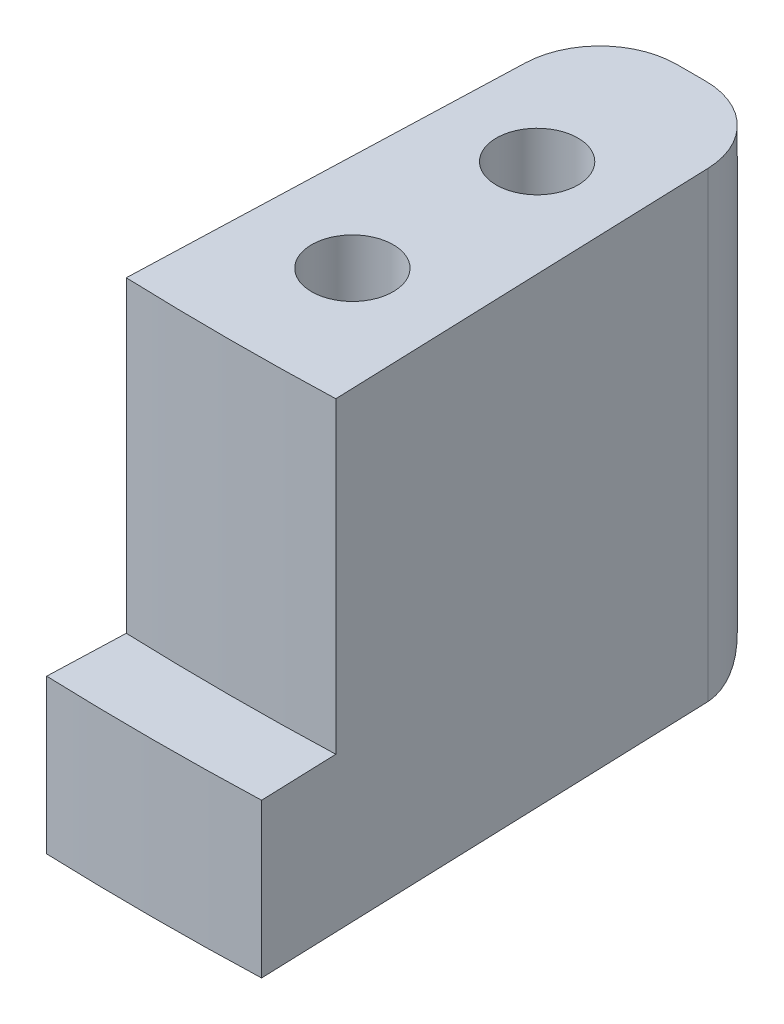
ISO-10303-21;
HEADER;
FILE_DESCRIPTION(('STEP AP214'),'2;1');
FILE_NAME('part.step','',(''),(''),'','','');
FILE_SCHEMA(('AUTOMOTIVE_DESIGN { 1 0 10303 214 1 1 1 1 }'));
ENDSEC;
DATA;
#1=APPLICATION_CONTEXT('core data for automotive mechanical design processes');
#2=APPLICATION_PROTOCOL_DEFINITION('international standard','automotive_design',2000,#1);
#3=PRODUCT_CONTEXT('',#1,'mechanical');
#4=PRODUCT('Part','Part','',(#3));
#5=PRODUCT_RELATED_PRODUCT_CATEGORY('part','',(#4));
#6=PRODUCT_DEFINITION_FORMATION('','',#4);
#7=PRODUCT_DEFINITION_CONTEXT('part definition',#1,'design');
#8=PRODUCT_DEFINITION('design','',#6,#7);
#9=PRODUCT_DEFINITION_SHAPE('','',#8);
#10=(LENGTH_UNIT() NAMED_UNIT(*) SI_UNIT(.MILLI.,.METRE.));
#11=(NAMED_UNIT(*) PLANE_ANGLE_UNIT() SI_UNIT($,.RADIAN.));
#12=(NAMED_UNIT(*) SI_UNIT($,.STERADIAN.) SOLID_ANGLE_UNIT());
#13=UNCERTAINTY_MEASURE_WITH_UNIT(LENGTH_MEASURE(1.E-05),#10,'distance_accuracy_value','');
#14=(GEOMETRIC_REPRESENTATION_CONTEXT(3) GLOBAL_UNCERTAINTY_ASSIGNED_CONTEXT((#13)) GLOBAL_UNIT_ASSIGNED_CONTEXT((#10,
#11,#12)) REPRESENTATION_CONTEXT('',''));
#15=CARTESIAN_POINT('',(0.,0.,0.));
#16=DIRECTION('',(0.,0.,1.));
#17=DIRECTION('',(1.,0.,0.));
#18=AXIS2_PLACEMENT_3D('',#15,#16,#17);
#19=CARTESIAN_POINT('',(0.,30.,175.));
#20=DIRECTION('',(0.,1.,0.));
#21=DIRECTION('',(0.,0.,1.));
#22=AXIS2_PLACEMENT_3D('',#19,#20,#21);
#23=CYLINDRICAL_SURFACE('',#22,2.65);
#24=CARTESIAN_POINT('',(0.,30.,175.));
#25=DIRECTION('',(0.,1.,0.));
#26=DIRECTION('',(0.,0.,1.));
#27=AXIS2_PLACEMENT_3D('',#24,#25,#26);
#28=CIRCLE('',#27,2.65);
#29=CARTESIAN_POINT('',(0.,30.,177.65));
#30=VERTEX_POINT('',#29);
#31=EDGE_CURVE('E285',#30,#30,#28,.T.);
#32=ORIENTED_EDGE('',*,*,#31,.T.);
#33=EDGE_LOOP('',(#32));
#34=FACE_BOUND('',#33,.T.);
#35=CARTESIAN_POINT('',(0.,5.,175.));
#36=DIRECTION('',(0.,-1.,0.));
#37=DIRECTION('',(0.,0.,-1.));
#38=AXIS2_PLACEMENT_3D('',#35,#36,#37);
#39=CIRCLE('',#38,2.65);
#40=CARTESIAN_POINT('',(0.,5.,172.35));
#41=VERTEX_POINT('',#40);
#42=EDGE_CURVE('E40',#41,#41,#39,.F.);
#43=ORIENTED_EDGE('',*,*,#42,.F.);
#44=EDGE_LOOP('',(#43));
#45=FACE_BOUND('',#44,.T.);
#46=ADVANCED_FACE('F36',(#34,#45),#23,.F.);
#47=CARTESIAN_POINT('',(0.,30.,187.));
#48=DIRECTION('',(0.,1.,0.));
#49=DIRECTION('',(0.,0.,1.));
#50=AXIS2_PLACEMENT_3D('',#47,#48,#49);
#51=CYLINDRICAL_SURFACE('',#50,2.65);
#52=CARTESIAN_POINT('',(0.,30.,187.));
#53=DIRECTION('',(0.,1.,0.));
#54=DIRECTION('',(0.,0.,1.));
#55=AXIS2_PLACEMENT_3D('',#52,#53,#54);
#56=CIRCLE('',#55,2.65);
#57=CARTESIAN_POINT('',(0.,30.,189.65));
#58=VERTEX_POINT('',#57);
#59=EDGE_CURVE('E282',#58,#58,#56,.T.);
#60=ORIENTED_EDGE('',*,*,#59,.T.);
#61=EDGE_LOOP('',(#60));
#62=FACE_BOUND('',#61,.T.);
#63=CARTESIAN_POINT('',(0.,5.,187.));
#64=DIRECTION('',(0.,-1.,0.));
#65=DIRECTION('',(0.,0.,-1.));
#66=AXIS2_PLACEMENT_3D('',#63,#64,#65);
#67=CIRCLE('',#66,2.65);
#68=CARTESIAN_POINT('',(0.,5.,184.35));
#69=VERTEX_POINT('',#68);
#70=EDGE_CURVE('E229',#69,#69,#67,.F.);
#71=ORIENTED_EDGE('',*,*,#70,.F.);
#72=EDGE_LOOP('',(#71));
#73=FACE_BOUND('',#72,.T.);
#74=ADVANCED_FACE('F355',(#62,#73),#51,.F.);
#75=CARTESIAN_POINT('',(0.,30.,0.));
#76=DIRECTION('',(0.999390827019096,0.,0.034899496702501));
#77=DIRECTION('',(0.034899496702501,0.,-0.999390827019096));
#78=AXIS2_PLACEMENT_3D('',#75,#76,#77);
#79=PLANE('',#78);
#80=DIRECTION('',(-0.034899496702501,0.,0.999390827019096));
#81=VECTOR('',#80,1.);
#82=CARTESIAN_POINT('',(0.,30.,0.));
#83=LINE('',#82,#81);
#84=CARTESIAN_POINT('',(-5.93043722719849,30.,169.825502516488));
#85=VERTEX_POINT('',#84);
#86=CARTESIAN_POINT('',(-6.80540185698768,30.,194.881211268724));
#87=VERTEX_POINT('',#86);
#88=EDGE_CURVE('E310',#85,#87,#83,.T.);
#89=ORIENTED_EDGE('',*,*,#88,.F.);
#90=DIRECTION('',(0.,-1.,0.));
#91=VECTOR('',#90,1.);
#92=CARTESIAN_POINT('',(-5.93043722719848,0.,169.825502516488));
#93=LINE('',#92,#91);
#94=CARTESIAN_POINT('',(-5.93043722719848,0.00304586490452183,169.825502516488));
#95=VERTEX_POINT('',#94);
#96=EDGE_CURVE('E330',#85,#95,#93,.T.);
#97=ORIENTED_EDGE('',*,*,#96,.T.);
#98=CARTESIAN_POINT('',(-5.93653081359711,5.,170.));
#99=DIRECTION('',(0.999390827019096,0.,0.034899496702501));
#100=DIRECTION('',(-0.034899496702501,0.,0.999390827019096));
#101=AXIS2_PLACEMENT_3D('',#98,#99,#100);
#102=ELLIPSE('',#101,5.00304772149411,5.);
#103=CARTESIAN_POINT('',(-5.93653081359711,0.,170.));
#104=VERTEX_POINT('',#103);
#105=EDGE_CURVE('E328',#95,#104,#102,.F.);
#106=ORIENTED_EDGE('',*,*,#105,.T.);
#107=DIRECTION('',(-0.034899496702501,0.,0.999390827019096));
#108=VECTOR('',#107,1.);
#109=CARTESIAN_POINT('',(0.,0.,0.));
#110=LINE('',#109,#108);
#111=CARTESIAN_POINT('',(-6.97989934050019,0.,199.878165403819));
#112=VERTEX_POINT('',#111);
#113=EDGE_CURVE('E309',#104,#112,#110,.T.);
#114=ORIENTED_EDGE('',*,*,#113,.T.);
#115=DIRECTION('',(0.,-1.,0.));
#116=VECTOR('',#115,1.);
#117=CARTESIAN_POINT('',(-6.97989934050019,10.,199.878165403819));
#118=LINE('',#117,#116);
#119=CARTESIAN_POINT('',(-6.97989934050019,10.,199.878165403819));
#120=VERTEX_POINT('',#119);
#121=EDGE_CURVE('E306',#120,#112,#118,.T.);
#122=ORIENTED_EDGE('',*,*,#121,.F.);
#123=DIRECTION('',(-0.034899496702501,0.,0.999390827019096));
#124=VECTOR('',#123,1.);
#125=CARTESIAN_POINT('',(0.,10.,0.));
#126=LINE('',#125,#124);
#127=CARTESIAN_POINT('',(-6.80540185698768,10.,194.881211268724));
#128=VERTEX_POINT('',#127);
#129=EDGE_CURVE('E289',#128,#120,#126,.T.);
#130=ORIENTED_EDGE('',*,*,#129,.F.);
#131=DIRECTION('',(0.,-1.,0.));
#132=VECTOR('',#131,1.);
#133=CARTESIAN_POINT('',(-6.80540185698768,30.,194.881211268724));
#134=LINE('',#133,#132);
#135=EDGE_CURVE('E326',#87,#128,#134,.T.);
#136=ORIENTED_EDGE('',*,*,#135,.F.);
#137=EDGE_LOOP('',(#89,#97,#106,#114,#122,#130,#136));
#138=FACE_BOUND('',#137,.T.);
#139=ADVANCED_FACE('F362',(#138),#79,.F.);
#140=CARTESIAN_POINT('',(0.,30.,0.));
#141=DIRECTION('',(0.,-1.,0.));
#142=DIRECTION('',(0.,0.,-1.));
#143=AXIS2_PLACEMENT_3D('',#140,#141,#142);
#144=CYLINDRICAL_SURFACE('',#143,195.);
#145=ORIENTED_EDGE('',*,*,#135,.T.);
#146=CARTESIAN_POINT('',(0.,10.,0.));
#147=DIRECTION('',(0.,1.,0.));
#148=DIRECTION('',(0.,0.,1.));
#149=AXIS2_PLACEMENT_3D('',#146,#147,#148);
#150=CIRCLE('',#149,195.);
#151=CARTESIAN_POINT('',(6.80540185698774,10.,194.881211268724));
#152=VERTEX_POINT('',#151);
#153=EDGE_CURVE('E298',#128,#152,#150,.T.);
#154=ORIENTED_EDGE('',*,*,#153,.T.);
#155=DIRECTION('',(0.,-1.,0.));
#156=VECTOR('',#155,1.);
#157=CARTESIAN_POINT('',(6.80540185698774,30.,194.881211268724));
#158=LINE('',#157,#156);
#159=CARTESIAN_POINT('',(6.80540185698774,30.,194.881211268724));
#160=VERTEX_POINT('',#159);
#161=EDGE_CURVE('E321',#160,#152,#158,.T.);
#162=ORIENTED_EDGE('',*,*,#161,.F.);
#163=CARTESIAN_POINT('',(0.,30.,0.));
#164=DIRECTION('',(0.,1.,0.));
#165=DIRECTION('',(0.,0.,1.));
#166=AXIS2_PLACEMENT_3D('',#163,#164,#165);
#167=CIRCLE('',#166,195.);
#168=EDGE_CURVE('E312',#87,#160,#167,.T.);
#169=ORIENTED_EDGE('',*,*,#168,.F.);
#170=EDGE_LOOP('',(#145,#154,#162,#169));
#171=FACE_BOUND('',#170,.T.);
#172=ADVANCED_FACE('F390',(#171),#144,.T.);
#173=CARTESIAN_POINT('',(0.,30.,0.));
#174=DIRECTION('',(0.999390827019096,0.,-0.0348994967025013));
#175=DIRECTION('',(-0.0348994967025013,0.,-0.999390827019096));
#176=AXIS2_PLACEMENT_3D('',#173,#174,#175);
#177=PLANE('',#176);
#178=CARTESIAN_POINT('',(5.93653081359717,5.,170.));
#179=DIRECTION('',(0.999390827019096,0.,-0.0348994967025013));
#180=DIRECTION('',(-0.0348994967025013,0.,-0.999390827019096));
#181=AXIS2_PLACEMENT_3D('',#178,#179,#180);
#182=ELLIPSE('',#181,5.00304772149411,5.);
#183=CARTESIAN_POINT('',(5.93653081359717,0.,170.));
#184=VERTEX_POINT('',#183);
#185=CARTESIAN_POINT('',(5.93043722719854,0.00304586490452313,169.825502516488));
#186=VERTEX_POINT('',#185);
#187=EDGE_CURVE('E343',#184,#186,#182,.T.);
#188=ORIENTED_EDGE('',*,*,#187,.T.);
#189=DIRECTION('',(0.,-1.,0.));
#190=VECTOR('',#189,1.);
#191=CARTESIAN_POINT('',(5.93043722719854,30.,169.825502516488));
#192=LINE('',#191,#190);
#193=CARTESIAN_POINT('',(5.93043722719854,30.,169.825502516488));
#194=VERTEX_POINT('',#193);
#195=EDGE_CURVE('E45',#186,#194,#192,.F.);
#196=ORIENTED_EDGE('',*,*,#195,.T.);
#197=DIRECTION('',(0.0348994967025013,0.,0.999390827019096));
#198=VECTOR('',#197,1.);
#199=CARTESIAN_POINT('',(0.,30.,0.));
#200=LINE('',#199,#198);
#201=EDGE_CURVE('E316',#194,#160,#200,.T.);
#202=ORIENTED_EDGE('',*,*,#201,.T.);
#203=ORIENTED_EDGE('',*,*,#161,.T.);
#204=DIRECTION('',(0.0348994967025013,0.,0.999390827019096));
#205=VECTOR('',#204,1.);
#206=CARTESIAN_POINT('',(0.,10.,0.));
#207=LINE('',#206,#205);
#208=CARTESIAN_POINT('',(6.97989934050026,10.,199.878165403819));
#209=VERTEX_POINT('',#208);
#210=EDGE_CURVE('E295',#152,#209,#207,.T.);
#211=ORIENTED_EDGE('',*,*,#210,.T.);
#212=DIRECTION('',(0.,-1.,0.));
#213=VECTOR('',#212,1.);
#214=CARTESIAN_POINT('',(6.97989934050026,10.,199.878165403819));
#215=LINE('',#214,#213);
#216=CARTESIAN_POINT('',(6.97989934050026,0.,199.878165403819));
#217=VERTEX_POINT('',#216);
#218=EDGE_CURVE('E300',#209,#217,#215,.T.);
#219=ORIENTED_EDGE('',*,*,#218,.T.);
#220=DIRECTION('',(0.0348994967025013,0.,0.999390827019096));
#221=VECTOR('',#220,1.);
#222=CARTESIAN_POINT('',(0.,0.,0.));
#223=LINE('',#222,#221);
#224=EDGE_CURVE('E313',#184,#217,#223,.T.);
#225=ORIENTED_EDGE('',*,*,#224,.F.);
#226=EDGE_LOOP('',(#188,#196,#202,#203,#211,#219,#225));
#227=FACE_BOUND('',#226,.T.);
#228=ADVANCED_FACE('F386',(#227),#177,.T.);
#229=CARTESIAN_POINT('',(0.,30.,165.));
#230=DIRECTION('',(0.,0.,-1.));
#231=DIRECTION('',(-1.,0.,0.));
#232=AXIS2_PLACEMENT_3D('',#229,#230,#231);
#233=PLANE('',#232);
#234=DIRECTION('',(1.,0.,0.));
#235=VECTOR('',#234,1.);
#236=CARTESIAN_POINT('',(-5.76192696613837,5.,165.));
#237=LINE('',#236,#235);
#238=CARTESIAN_POINT('',(0.933483092103059,5.,165.));
#239=VERTEX_POINT('',#238);
#240=CARTESIAN_POINT('',(-0.933483092103004,5.,165.));
#241=VERTEX_POINT('',#240);
#242=EDGE_CURVE('E333',#239,#241,#237,.F.);
#243=ORIENTED_EDGE('',*,*,#242,.T.);
#244=DIRECTION('',(0.,-1.,0.));
#245=VECTOR('',#244,1.);
#246=CARTESIAN_POINT('',(-0.933483092103004,30.,165.));
#247=LINE('',#246,#245);
#248=CARTESIAN_POINT('',(-0.933483092103004,30.,165.));
#249=VERTEX_POINT('',#248);
#250=EDGE_CURVE('E337',#241,#249,#247,.F.);
#251=ORIENTED_EDGE('',*,*,#250,.T.);
#252=DIRECTION('',(1.,0.,0.));
#253=VECTOR('',#252,1.);
#254=CARTESIAN_POINT('',(0.,30.,165.));
#255=LINE('',#254,#253);
#256=CARTESIAN_POINT('',(0.933483092103059,30.,165.));
#257=VERTEX_POINT('',#256);
#258=EDGE_CURVE('E318',#249,#257,#255,.T.);
#259=ORIENTED_EDGE('',*,*,#258,.T.);
#260=DIRECTION('',(0.,-1.,0.));
#261=VECTOR('',#260,1.);
#262=CARTESIAN_POINT('',(0.933483092103059,30.,165.));
#263=LINE('',#262,#261);
#264=EDGE_CURVE('E335',#257,#239,#263,.T.);
#265=ORIENTED_EDGE('',*,*,#264,.T.);
#266=EDGE_LOOP('',(#243,#251,#259,#265));
#267=FACE_BOUND('',#266,.T.);
#268=ADVANCED_FACE('F379',(#267),#233,.T.);
#269=CARTESIAN_POINT('',(0.,30.,0.));
#270=DIRECTION('',(0.,1.,0.));
#271=DIRECTION('',(0.,0.,1.));
#272=AXIS2_PLACEMENT_3D('',#269,#270,#271);
#273=PLANE('',#272);
#274=ORIENTED_EDGE('',*,*,#59,.F.);
#275=EDGE_LOOP('',(#274));
#276=FACE_BOUND('',#275,.T.);
#277=ORIENTED_EDGE('',*,*,#31,.F.);
#278=EDGE_LOOP('',(#277));
#279=FACE_BOUND('',#278,.T.);
#280=ORIENTED_EDGE('',*,*,#258,.F.);
#281=CARTESIAN_POINT('',(-0.933483092103004,30.,170.));
#282=DIRECTION('',(0.,1.,0.));
#283=DIRECTION('',(0.,0.,1.));
#284=AXIS2_PLACEMENT_3D('',#281,#282,#283);
#285=CIRCLE('',#284,5.);
#286=EDGE_CURVE('E341',#249,#85,#285,.T.);
#287=ORIENTED_EDGE('',*,*,#286,.T.);
#288=ORIENTED_EDGE('',*,*,#88,.T.);
#289=ORIENTED_EDGE('',*,*,#168,.T.);
#290=ORIENTED_EDGE('',*,*,#201,.F.);
#291=CARTESIAN_POINT('',(0.933483092103059,30.,170.));
#292=DIRECTION('',(0.,1.,0.));
#293=DIRECTION('',(0.,0.,1.));
#294=AXIS2_PLACEMENT_3D('',#291,#292,#293);
#295=CIRCLE('',#294,5.);
#296=EDGE_CURVE('E339',#194,#257,#295,.T.);
#297=ORIENTED_EDGE('',*,*,#296,.T.);
#298=EDGE_LOOP('',(#280,#287,#288,#289,#290,#297));
#299=FACE_BOUND('',#298,.T.);
#300=ADVANCED_FACE('F376',(#276,#279,#299),#273,.T.);
#301=CARTESIAN_POINT('',(0.,0.,0.));
#302=DIRECTION('',(0.,1.,0.));
#303=DIRECTION('',(0.,0.,1.));
#304=AXIS2_PLACEMENT_3D('',#301,#302,#303);
#305=PLANE('',#304);
#306=DIRECTION('',(0.5,0.,-0.866025403784439));
#307=VECTOR('',#306,1.);
#308=CARTESIAN_POINT('',(-4.7920072342739,0.,175.));
#309=LINE('',#308,#307);
#310=CARTESIAN_POINT('',(-4.79200723427387,0.,175.));
#311=VERTEX_POINT('',#310);
#312=CARTESIAN_POINT('',(-2.39600361713693,0.,170.85));
#313=VERTEX_POINT('',#312);
#314=EDGE_CURVE('E216',#311,#313,#309,.T.);
#315=ORIENTED_EDGE('',*,*,#314,.F.);
#316=DIRECTION('',(-0.5,0.,-0.866025403784439));
#317=VECTOR('',#316,1.);
#318=CARTESIAN_POINT('',(-2.39600361713698,0.,179.15));
#319=LINE('',#318,#317);
#320=CARTESIAN_POINT('',(-2.39600361713698,0.,179.15));
#321=VERTEX_POINT('',#320);
#322=EDGE_CURVE('E53',#321,#311,#319,.T.);
#323=ORIENTED_EDGE('',*,*,#322,.F.);
#324=DIRECTION('',(-1.,0.,0.));
#325=VECTOR('',#324,1.);
#326=CARTESIAN_POINT('',(2.39600361713694,0.,179.15));
#327=LINE('',#326,#325);
#328=CARTESIAN_POINT('',(2.39600361713694,0.,179.15));
#329=VERTEX_POINT('',#328);
#330=EDGE_CURVE('E202',#329,#321,#327,.T.);
#331=ORIENTED_EDGE('',*,*,#330,.F.);
#332=DIRECTION('',(-0.5,0.,0.866025403784438));
#333=VECTOR('',#332,1.);
#334=CARTESIAN_POINT('',(4.79200723427388,0.,175.));
#335=LINE('',#334,#333);
#336=CARTESIAN_POINT('',(4.79200723427388,0.,175.));
#337=VERTEX_POINT('',#336);
#338=EDGE_CURVE('E205',#337,#329,#335,.T.);
#339=ORIENTED_EDGE('',*,*,#338,.F.);
#340=DIRECTION('',(0.5,0.,0.866025403784439));
#341=VECTOR('',#340,1.);
#342=CARTESIAN_POINT('',(2.39600361713692,0.,170.85));
#343=LINE('',#342,#341);
#344=CARTESIAN_POINT('',(2.39600361713692,0.,170.85));
#345=VERTEX_POINT('',#344);
#346=EDGE_CURVE('E222',#345,#337,#343,.T.);
#347=ORIENTED_EDGE('',*,*,#346,.F.);
#348=DIRECTION('',(1.,0.,0.));
#349=VECTOR('',#348,1.);
#350=CARTESIAN_POINT('',(-2.39600361713693,0.,170.85));
#351=LINE('',#350,#349);
#352=EDGE_CURVE('E219',#313,#345,#351,.T.);
#353=ORIENTED_EDGE('',*,*,#352,.F.);
#354=EDGE_LOOP('',(#315,#323,#331,#339,#347,#353));
#355=FACE_BOUND('',#354,.T.);
#356=DIRECTION('',(0.500000000000001,0.,-0.866025403784438));
#357=VECTOR('',#356,1.);
#358=CARTESIAN_POINT('',(-4.79200723427391,0.,187.));
#359=LINE('',#358,#357);
#360=CARTESIAN_POINT('',(-4.79200723427391,0.,187.));
#361=VERTEX_POINT('',#360);
#362=CARTESIAN_POINT('',(-2.39600361713695,0.,182.85));
#363=VERTEX_POINT('',#362);
#364=EDGE_CURVE('E258',#361,#363,#359,.T.);
#365=ORIENTED_EDGE('',*,*,#364,.F.);
#366=DIRECTION('',(-0.499999999999999,0.,-0.866025403784439));
#367=VECTOR('',#366,1.);
#368=CARTESIAN_POINT('',(-2.39600361713696,0.,191.15));
#369=LINE('',#368,#367);
#370=CARTESIAN_POINT('',(-2.39600361713696,0.,191.15));
#371=VERTEX_POINT('',#370);
#372=EDGE_CURVE('E61',#371,#361,#369,.T.);
#373=ORIENTED_EDGE('',*,*,#372,.F.);
#374=DIRECTION('',(-1.,0.,0.));
#375=VECTOR('',#374,1.);
#376=CARTESIAN_POINT('',(2.39600361713698,0.,191.15));
#377=LINE('',#376,#375);
#378=CARTESIAN_POINT('',(2.39600361713698,0.,191.15));
#379=VERTEX_POINT('',#378);
#380=EDGE_CURVE('E241',#379,#371,#377,.T.);
#381=ORIENTED_EDGE('',*,*,#380,.F.);
#382=DIRECTION('',(-0.5,0.,0.866025403784439));
#383=VECTOR('',#382,1.);
#384=CARTESIAN_POINT('',(4.79200723427392,0.,187.));
#385=LINE('',#384,#383);
#386=CARTESIAN_POINT('',(4.79200723427392,0.,187.));
#387=VERTEX_POINT('',#386);
#388=EDGE_CURVE('E267',#387,#379,#385,.T.);
#389=ORIENTED_EDGE('',*,*,#388,.F.);
#390=DIRECTION('',(0.5,0.,0.866025403784439));
#391=VECTOR('',#390,1.);
#392=CARTESIAN_POINT('',(2.39600361713694,0.,182.85));
#393=LINE('',#392,#391);
#394=CARTESIAN_POINT('',(2.39600361713694,0.,182.85));
#395=VERTEX_POINT('',#394);
#396=EDGE_CURVE('E264',#395,#387,#393,.T.);
#397=ORIENTED_EDGE('',*,*,#396,.F.);
#398=DIRECTION('',(1.,0.,0.));
#399=VECTOR('',#398,1.);
#400=CARTESIAN_POINT('',(-2.39600361713695,0.,182.85));
#401=LINE('',#400,#399);
#402=EDGE_CURVE('E261',#363,#395,#401,.T.);
#403=ORIENTED_EDGE('',*,*,#402,.F.);
#404=EDGE_LOOP('',(#365,#373,#381,#389,#397,#403));
#405=FACE_BOUND('',#404,.T.);
#406=ORIENTED_EDGE('',*,*,#113,.F.);
#407=DIRECTION('',(1.,0.,0.));
#408=VECTOR('',#407,1.);
#409=CARTESIAN_POINT('',(5.76192696613841,0.,170.));
#410=LINE('',#409,#408);
#411=EDGE_CURVE('E11',#104,#184,#410,.T.);
#412=ORIENTED_EDGE('',*,*,#411,.T.);
#413=ORIENTED_EDGE('',*,*,#224,.T.);
#414=CARTESIAN_POINT('',(0.,0.,0.));
#415=DIRECTION('',(0.,1.,0.));
#416=DIRECTION('',(0.,0.,1.));
#417=AXIS2_PLACEMENT_3D('',#414,#415,#416);
#418=CIRCLE('',#417,200.);
#419=EDGE_CURVE('E293',#112,#217,#418,.T.);
#420=ORIENTED_EDGE('',*,*,#419,.F.);
#421=EDGE_LOOP('',(#406,#412,#413,#420));
#422=FACE_BOUND('',#421,.T.);
#423=ADVANCED_FACE('F374',(#355,#405,#422),#305,.F.);
#424=CARTESIAN_POINT('',(0.,10.,0.));
#425=DIRECTION('',(0.,-1.,0.));
#426=DIRECTION('',(0.,0.,-1.));
#427=AXIS2_PLACEMENT_3D('',#424,#425,#426);
#428=CYLINDRICAL_SURFACE('',#427,200.);
#429=ORIENTED_EDGE('',*,*,#419,.T.);
#430=ORIENTED_EDGE('',*,*,#218,.F.);
#431=CARTESIAN_POINT('',(0.,10.,0.));
#432=DIRECTION('',(0.,1.,0.));
#433=DIRECTION('',(0.,0.,1.));
#434=AXIS2_PLACEMENT_3D('',#431,#432,#433);
#435=CIRCLE('',#434,200.);
#436=EDGE_CURVE('E292',#120,#209,#435,.T.);
#437=ORIENTED_EDGE('',*,*,#436,.F.);
#438=ORIENTED_EDGE('',*,*,#121,.T.);
#439=EDGE_LOOP('',(#429,#430,#437,#438));
#440=FACE_BOUND('',#439,.T.);
#441=ADVANCED_FACE('F370',(#440),#428,.T.);
#442=CARTESIAN_POINT('',(0.,10.,0.));
#443=DIRECTION('',(0.,1.,0.));
#444=DIRECTION('',(0.,0.,1.));
#445=AXIS2_PLACEMENT_3D('',#442,#443,#444);
#446=PLANE('',#445);
#447=ORIENTED_EDGE('',*,*,#129,.T.);
#448=ORIENTED_EDGE('',*,*,#436,.T.);
#449=ORIENTED_EDGE('',*,*,#210,.F.);
#450=ORIENTED_EDGE('',*,*,#153,.F.);
#451=EDGE_LOOP('',(#447,#448,#449,#450));
#452=FACE_BOUND('',#451,.T.);
#453=ADVANCED_FACE('F367',(#452),#446,.T.);
#454=CARTESIAN_POINT('',(0.933483092103059,30.,170.));
#455=DIRECTION('',(0.,-1.,0.));
#456=DIRECTION('',(0.,0.,-1.));
#457=AXIS2_PLACEMENT_3D('',#454,#455,#456);
#458=CYLINDRICAL_SURFACE('',#457,5.);
#459=ORIENTED_EDGE('',*,*,#296,.F.);
#460=ORIENTED_EDGE('',*,*,#195,.F.);
#461=CARTESIAN_POINT('',(0.933483092103059,5.,170.));
#462=DIRECTION('',(-0.707106781186547,-0.707106781186547,0.));
#463=DIRECTION('',(-0.707106781186547,0.707106781186547,0.));
#464=AXIS2_PLACEMENT_3D('',#461,#462,#463);
#465=ELLIPSE('',#464,7.07106781186547,5.);
#466=EDGE_CURVE('E303',#239,#186,#465,.T.);
#467=ORIENTED_EDGE('',*,*,#466,.F.);
#468=ORIENTED_EDGE('',*,*,#264,.F.);
#469=EDGE_LOOP('',(#459,#460,#467,#468));
#470=FACE_BOUND('',#469,.T.);
#471=ADVANCED_FACE('F38',(#470),#458,.T.);
#472=CARTESIAN_POINT('',(0.,5.,170.));
#473=DIRECTION('',(-1.,0.,0.));
#474=DIRECTION('',(0.,0.,1.));
#475=AXIS2_PLACEMENT_3D('',#472,#473,#474);
#476=CYLINDRICAL_SURFACE('',#475,5.);
#477=ORIENTED_EDGE('',*,*,#411,.F.);
#478=ORIENTED_EDGE('',*,*,#105,.F.);
#479=CARTESIAN_POINT('',(-0.933483092103004,5.,170.));
#480=DIRECTION('',(-0.707106781186547,0.707106781186547,0.));
#481=DIRECTION('',(-0.707106781186547,-0.707106781186547,0.));
#482=AXIS2_PLACEMENT_3D('',#479,#480,#481);
#483=ELLIPSE('',#482,7.07106781186547,5.);
#484=EDGE_CURVE('E288',#241,#95,#483,.T.);
#485=ORIENTED_EDGE('',*,*,#484,.F.);
#486=ORIENTED_EDGE('',*,*,#242,.F.);
#487=ORIENTED_EDGE('',*,*,#466,.T.);
#488=ORIENTED_EDGE('',*,*,#187,.F.);
#489=EDGE_LOOP('',(#477,#478,#485,#486,#487,#488));
#490=FACE_BOUND('',#489,.T.);
#491=ADVANCED_FACE('F401',(#490),#476,.T.);
#492=CARTESIAN_POINT('',(-0.933483092103004,30.,170.));
#493=DIRECTION('',(0.,1.,0.));
#494=DIRECTION('',(0.,0.,1.));
#495=AXIS2_PLACEMENT_3D('',#492,#493,#494);
#496=CYLINDRICAL_SURFACE('',#495,5.);
#497=ORIENTED_EDGE('',*,*,#286,.F.);
#498=ORIENTED_EDGE('',*,*,#250,.F.);
#499=ORIENTED_EDGE('',*,*,#484,.T.);
#500=ORIENTED_EDGE('',*,*,#96,.F.);
#501=EDGE_LOOP('',(#497,#498,#499,#500));
#502=FACE_BOUND('',#501,.T.);
#503=ADVANCED_FACE('F398',(#502),#496,.T.);
#504=CARTESIAN_POINT('',(0.,5.,0.));
#505=DIRECTION('',(0.,-1.,0.));
#506=DIRECTION('',(0.,0.,-1.));
#507=AXIS2_PLACEMENT_3D('',#504,#505,#506);
#508=PLANE('',#507);
#509=DIRECTION('',(-0.499999999999999,0.,-0.866025403784439));
#510=VECTOR('',#509,1.);
#511=CARTESIAN_POINT('',(-2.39600361713696,5.,191.15));
#512=LINE('',#511,#510);
#513=CARTESIAN_POINT('',(-2.39600361713696,5.,191.15));
#514=VERTEX_POINT('',#513);
#515=CARTESIAN_POINT('',(-4.79200723427391,5.,187.));
#516=VERTEX_POINT('',#515);
#517=EDGE_CURVE('E237',#514,#516,#512,.T.);
#518=ORIENTED_EDGE('',*,*,#517,.T.);
#519=DIRECTION('',(0.500000000000001,0.,-0.866025403784438));
#520=VECTOR('',#519,1.);
#521=CARTESIAN_POINT('',(-4.79200723427391,5.,187.));
#522=LINE('',#521,#520);
#523=CARTESIAN_POINT('',(-2.39600361713695,5.,182.85));
#524=VERTEX_POINT('',#523);
#525=EDGE_CURVE('E240',#516,#524,#522,.T.);
#526=ORIENTED_EDGE('',*,*,#525,.T.);
#527=DIRECTION('',(1.,0.,0.));
#528=VECTOR('',#527,1.);
#529=CARTESIAN_POINT('',(-2.39600361713695,5.,182.85));
#530=LINE('',#529,#528);
#531=CARTESIAN_POINT('',(2.39600361713694,5.,182.85));
#532=VERTEX_POINT('',#531);
#533=EDGE_CURVE('E244',#524,#532,#530,.T.);
#534=ORIENTED_EDGE('',*,*,#533,.T.);
#535=DIRECTION('',(0.5,0.,0.866025403784439));
#536=VECTOR('',#535,1.);
#537=CARTESIAN_POINT('',(2.39600361713694,5.,182.85));
#538=LINE('',#537,#536);
#539=CARTESIAN_POINT('',(4.79200723427392,5.,187.));
#540=VERTEX_POINT('',#539);
#541=EDGE_CURVE('E247',#532,#540,#538,.T.);
#542=ORIENTED_EDGE('',*,*,#541,.T.);
#543=DIRECTION('',(-0.5,0.,0.866025403784439));
#544=VECTOR('',#543,1.);
#545=CARTESIAN_POINT('',(4.79200723427392,5.,187.));
#546=LINE('',#545,#544);
#547=CARTESIAN_POINT('',(2.39600361713698,5.,191.15));
#548=VERTEX_POINT('',#547);
#549=EDGE_CURVE('E250',#540,#548,#546,.T.);
#550=ORIENTED_EDGE('',*,*,#549,.T.);
#551=DIRECTION('',(-1.,0.,0.));
#552=VECTOR('',#551,1.);
#553=CARTESIAN_POINT('',(2.39600361713698,5.,191.15));
#554=LINE('',#553,#552);
#555=EDGE_CURVE('E253',#548,#514,#554,.T.);
#556=ORIENTED_EDGE('',*,*,#555,.T.);
#557=EDGE_LOOP('',(#518,#526,#534,#542,#550,#556));
#558=FACE_BOUND('',#557,.T.);
#559=ORIENTED_EDGE('',*,*,#70,.T.);
#560=EDGE_LOOP('',(#559));
#561=FACE_BOUND('',#560,.T.);
#562=ADVANCED_FACE('F400',(#558,#561),#508,.T.);
#563=CARTESIAN_POINT('',(-2.39600361713696,5.,191.15));
#564=DIRECTION('',(-0.866025403784439,0.,0.499999999999999));
#565=DIRECTION('',(0.499999999999999,0.,0.86602540378444));
#566=AXIS2_PLACEMENT_3D('',#563,#564,#565);
#567=PLANE('',#566);
#568=ORIENTED_EDGE('',*,*,#372,.T.);
#569=DIRECTION('',(0.,-1.,0.));
#570=VECTOR('',#569,1.);
#571=CARTESIAN_POINT('',(-4.79200723427391,5.,187.));
#572=LINE('',#571,#570);
#573=EDGE_CURVE('E256',#516,#361,#572,.T.);
#574=ORIENTED_EDGE('',*,*,#573,.F.);
#575=ORIENTED_EDGE('',*,*,#517,.F.);
#576=DIRECTION('',(0.,-1.,0.));
#577=VECTOR('',#576,1.);
#578=CARTESIAN_POINT('',(-2.39600361713696,5.,191.15));
#579=LINE('',#578,#577);
#580=EDGE_CURVE('E217',#514,#371,#579,.T.);
#581=ORIENTED_EDGE('',*,*,#580,.T.);
#582=EDGE_LOOP('',(#568,#574,#575,#581));
#583=FACE_BOUND('',#582,.T.);
#584=ADVANCED_FACE('F523',(#583),#567,.F.);
#585=CARTESIAN_POINT('',(2.39600361713698,5.,191.15));
#586=DIRECTION('',(0.,0.,1.));
#587=DIRECTION('',(1.,0.,0.));
#588=AXIS2_PLACEMENT_3D('',#585,#586,#587);
#589=PLANE('',#588);
#590=ORIENTED_EDGE('',*,*,#380,.T.);
#591=ORIENTED_EDGE('',*,*,#580,.F.);
#592=ORIENTED_EDGE('',*,*,#555,.F.);
#593=DIRECTION('',(0.,-1.,0.));
#594=VECTOR('',#593,1.);
#595=CARTESIAN_POINT('',(2.39600361713698,5.,191.15));
#596=LINE('',#595,#594);
#597=EDGE_CURVE('E273',#548,#379,#596,.T.);
#598=ORIENTED_EDGE('',*,*,#597,.T.);
#599=EDGE_LOOP('',(#590,#591,#592,#598));
#600=FACE_BOUND('',#599,.T.);
#601=ADVANCED_FACE('F530',(#600),#589,.F.);
#602=CARTESIAN_POINT('',(4.79200723427392,5.,187.));
#603=DIRECTION('',(0.866025403784439,0.,0.5));
#604=DIRECTION('',(0.5,0.,-0.866025403784439));
#605=AXIS2_PLACEMENT_3D('',#602,#603,#604);
#606=PLANE('',#605);
#607=ORIENTED_EDGE('',*,*,#388,.T.);
#608=ORIENTED_EDGE('',*,*,#597,.F.);
#609=ORIENTED_EDGE('',*,*,#549,.F.);
#610=DIRECTION('',(0.,-1.,0.));
#611=VECTOR('',#610,1.);
#612=CARTESIAN_POINT('',(4.79200723427392,5.,187.));
#613=LINE('',#612,#611);
#614=EDGE_CURVE('E275',#540,#387,#613,.T.);
#615=ORIENTED_EDGE('',*,*,#614,.T.);
#616=EDGE_LOOP('',(#607,#608,#609,#615));
#617=FACE_BOUND('',#616,.T.);
#618=ADVANCED_FACE('F536',(#617),#606,.F.);
#619=CARTESIAN_POINT('',(2.39600361713694,5.,182.85));
#620=DIRECTION('',(0.866025403784438,0.,-0.5));
#621=DIRECTION('',(-0.5,0.,-0.866025403784439));
#622=AXIS2_PLACEMENT_3D('',#619,#620,#621);
#623=PLANE('',#622);
#624=ORIENTED_EDGE('',*,*,#396,.T.);
#625=ORIENTED_EDGE('',*,*,#614,.F.);
#626=ORIENTED_EDGE('',*,*,#541,.F.);
#627=DIRECTION('',(0.,-1.,0.));
#628=VECTOR('',#627,1.);
#629=CARTESIAN_POINT('',(2.39600361713694,5.,182.85));
#630=LINE('',#629,#628);
#631=EDGE_CURVE('E277',#532,#395,#630,.T.);
#632=ORIENTED_EDGE('',*,*,#631,.T.);
#633=EDGE_LOOP('',(#624,#625,#626,#632));
#634=FACE_BOUND('',#633,.T.);
#635=ADVANCED_FACE('F544',(#634),#623,.F.);
#636=CARTESIAN_POINT('',(-2.39600361713695,5.,182.85));
#637=DIRECTION('',(0.,0.,-1.));
#638=DIRECTION('',(-1.,0.,0.));
#639=AXIS2_PLACEMENT_3D('',#636,#637,#638);
#640=PLANE('',#639);
#641=ORIENTED_EDGE('',*,*,#402,.T.);
#642=ORIENTED_EDGE('',*,*,#631,.F.);
#643=ORIENTED_EDGE('',*,*,#533,.F.);
#644=DIRECTION('',(0.,-1.,0.));
#645=VECTOR('',#644,1.);
#646=CARTESIAN_POINT('',(-2.39600361713695,5.,182.85));
#647=LINE('',#646,#645);
#648=EDGE_CURVE('E279',#524,#363,#647,.T.);
#649=ORIENTED_EDGE('',*,*,#648,.T.);
#650=EDGE_LOOP('',(#641,#642,#643,#649));
#651=FACE_BOUND('',#650,.T.);
#652=ADVANCED_FACE('F552',(#651),#640,.F.);
#653=CARTESIAN_POINT('',(-4.79200723427391,5.,187.));
#654=DIRECTION('',(-0.866025403784438,0.,-0.500000000000001));
#655=DIRECTION('',(-0.500000000000001,0.,0.866025403784438));
#656=AXIS2_PLACEMENT_3D('',#653,#654,#655);
#657=PLANE('',#656);
#658=ORIENTED_EDGE('',*,*,#364,.T.);
#659=ORIENTED_EDGE('',*,*,#648,.F.);
#660=ORIENTED_EDGE('',*,*,#525,.F.);
#661=ORIENTED_EDGE('',*,*,#573,.T.);
#662=EDGE_LOOP('',(#658,#659,#660,#661));
#663=FACE_BOUND('',#662,.T.);
#664=ADVANCED_FACE('F560',(#663),#657,.F.);
#665=CARTESIAN_POINT('',(0.,5.,0.));
#666=DIRECTION('',(0.,-1.,0.));
#667=DIRECTION('',(0.,0.,-1.));
#668=AXIS2_PLACEMENT_3D('',#665,#666,#667);
#669=PLANE('',#668);
#670=DIRECTION('',(-0.5,0.,-0.866025403784439));
#671=VECTOR('',#670,1.);
#672=CARTESIAN_POINT('',(-2.39600361713698,5.,179.15));
#673=LINE('',#672,#671);
#674=CARTESIAN_POINT('',(-2.39600361713698,5.,179.15));
#675=VERTEX_POINT('',#674);
#676=CARTESIAN_POINT('',(-4.7920072342739,5.,175.));
#677=VERTEX_POINT('',#676);
#678=EDGE_CURVE('E182',#675,#677,#673,.T.);
#679=ORIENTED_EDGE('',*,*,#678,.T.);
#680=DIRECTION('',(0.5,0.,-0.866025403784439));
#681=VECTOR('',#680,1.);
#682=CARTESIAN_POINT('',(-4.7920072342739,5.,175.));
#683=LINE('',#682,#681);
#684=CARTESIAN_POINT('',(-2.39600361713693,5.,170.85));
#685=VERTEX_POINT('',#684);
#686=EDGE_CURVE('E191',#677,#685,#683,.T.);
#687=ORIENTED_EDGE('',*,*,#686,.T.);
#688=DIRECTION('',(1.,0.,0.));
#689=VECTOR('',#688,1.);
#690=CARTESIAN_POINT('',(-2.39600361713693,5.,170.85));
#691=LINE('',#690,#689);
#692=CARTESIAN_POINT('',(2.39600361713692,5.,170.85));
#693=VERTEX_POINT('',#692);
#694=EDGE_CURVE('E196',#685,#693,#691,.T.);
#695=ORIENTED_EDGE('',*,*,#694,.T.);
#696=DIRECTION('',(0.5,0.,0.866025403784439));
#697=VECTOR('',#696,1.);
#698=CARTESIAN_POINT('',(2.39600361713692,5.,170.85));
#699=LINE('',#698,#697);
#700=CARTESIAN_POINT('',(4.79200723427388,5.,175.));
#701=VERTEX_POINT('',#700);
#702=EDGE_CURVE('E209',#693,#701,#699,.T.);
#703=ORIENTED_EDGE('',*,*,#702,.T.);
#704=DIRECTION('',(-0.5,0.,0.866025403784438));
#705=VECTOR('',#704,1.);
#706=CARTESIAN_POINT('',(4.79200723427388,5.,175.));
#707=LINE('',#706,#705);
#708=CARTESIAN_POINT('',(2.39600361713694,5.,179.15));
#709=VERTEX_POINT('',#708);
#710=EDGE_CURVE('E212',#701,#709,#707,.T.);
#711=ORIENTED_EDGE('',*,*,#710,.T.);
#712=DIRECTION('',(-1.,0.,0.));
#713=VECTOR('',#712,1.);
#714=CARTESIAN_POINT('',(2.39600361713694,5.,179.15));
#715=LINE('',#714,#713);
#716=EDGE_CURVE('E188',#709,#675,#715,.T.);
#717=ORIENTED_EDGE('',*,*,#716,.T.);
#718=EDGE_LOOP('',(#679,#687,#695,#703,#711,#717));
#719=FACE_BOUND('',#718,.T.);
#720=ORIENTED_EDGE('',*,*,#42,.T.);
#721=EDGE_LOOP('',(#720));
#722=FACE_BOUND('',#721,.T.);
#723=ADVANCED_FACE('F198',(#719,#722),#669,.T.);
#724=CARTESIAN_POINT('',(-2.39600361713698,5.,179.15));
#725=DIRECTION('',(-0.866025403784439,0.,0.5));
#726=DIRECTION('',(0.5,0.,0.866025403784439));
#727=AXIS2_PLACEMENT_3D('',#724,#725,#726);
#728=PLANE('',#727);
#729=ORIENTED_EDGE('',*,*,#322,.T.);
#730=DIRECTION('',(0.,-1.,0.));
#731=VECTOR('',#730,1.);
#732=CARTESIAN_POINT('',(-4.7920072342739,5.,175.));
#733=LINE('',#732,#731);
#734=EDGE_CURVE('E178',#677,#311,#733,.T.);
#735=ORIENTED_EDGE('',*,*,#734,.F.);
#736=ORIENTED_EDGE('',*,*,#678,.F.);
#737=DIRECTION('',(0.,-1.,0.));
#738=VECTOR('',#737,1.);
#739=CARTESIAN_POINT('',(-2.39600361713698,5.,179.15));
#740=LINE('',#739,#738);
#741=EDGE_CURVE('E227',#675,#321,#740,.T.);
#742=ORIENTED_EDGE('',*,*,#741,.T.);
#743=EDGE_LOOP('',(#729,#735,#736,#742));
#744=FACE_BOUND('',#743,.T.);
#745=ADVANCED_FACE('F180',(#744),#728,.F.);
#746=CARTESIAN_POINT('',(2.39600361713694,5.,179.15));
#747=DIRECTION('',(0.,0.,1.));
#748=DIRECTION('',(1.,0.,0.));
#749=AXIS2_PLACEMENT_3D('',#746,#747,#748);
#750=PLANE('',#749);
#751=ORIENTED_EDGE('',*,*,#330,.T.);
#752=ORIENTED_EDGE('',*,*,#741,.F.);
#753=ORIENTED_EDGE('',*,*,#716,.F.);
#754=DIRECTION('',(0.,-1.,0.));
#755=VECTOR('',#754,1.);
#756=CARTESIAN_POINT('',(2.39600361713694,5.,179.15));
#757=LINE('',#756,#755);
#758=EDGE_CURVE('E230',#709,#329,#757,.T.);
#759=ORIENTED_EDGE('',*,*,#758,.T.);
#760=EDGE_LOOP('',(#751,#752,#753,#759));
#761=FACE_BOUND('',#760,.T.);
#762=ADVANCED_FACE('F581',(#761),#750,.F.);
#763=CARTESIAN_POINT('',(4.79200723427388,5.,175.));
#764=DIRECTION('',(0.866025403784438,0.,0.5));
#765=DIRECTION('',(0.5,0.,-0.866025403784439));
#766=AXIS2_PLACEMENT_3D('',#763,#764,#765);
#767=PLANE('',#766);
#768=ORIENTED_EDGE('',*,*,#338,.T.);
#769=ORIENTED_EDGE('',*,*,#758,.F.);
#770=ORIENTED_EDGE('',*,*,#710,.F.);
#771=DIRECTION('',(0.,-1.,0.));
#772=VECTOR('',#771,1.);
#773=CARTESIAN_POINT('',(4.79200723427388,5.,175.));
#774=LINE('',#773,#772);
#775=EDGE_CURVE('E232',#701,#337,#774,.T.);
#776=ORIENTED_EDGE('',*,*,#775,.T.);
#777=EDGE_LOOP('',(#768,#769,#770,#776));
#778=FACE_BOUND('',#777,.T.);
#779=ADVANCED_FACE('F588',(#778),#767,.F.);
#780=CARTESIAN_POINT('',(2.39600361713692,5.,170.85));
#781=DIRECTION('',(0.866025403784439,0.,-0.5));
#782=DIRECTION('',(-0.5,0.,-0.866025403784439));
#783=AXIS2_PLACEMENT_3D('',#780,#781,#782);
#784=PLANE('',#783);
#785=ORIENTED_EDGE('',*,*,#346,.T.);
#786=ORIENTED_EDGE('',*,*,#775,.F.);
#787=ORIENTED_EDGE('',*,*,#702,.F.);
#788=DIRECTION('',(0.,-1.,0.));
#789=VECTOR('',#788,1.);
#790=CARTESIAN_POINT('',(2.39600361713692,5.,170.85));
#791=LINE('',#790,#789);
#792=EDGE_CURVE('E234',#693,#345,#791,.T.);
#793=ORIENTED_EDGE('',*,*,#792,.T.);
#794=EDGE_LOOP('',(#785,#786,#787,#793));
#795=FACE_BOUND('',#794,.T.);
#796=ADVANCED_FACE('F596',(#795),#784,.F.);
#797=CARTESIAN_POINT('',(-2.39600361713693,5.,170.85));
#798=DIRECTION('',(0.,0.,-1.));
#799=DIRECTION('',(-1.,0.,0.));
#800=AXIS2_PLACEMENT_3D('',#797,#798,#799);
#801=PLANE('',#800);
#802=ORIENTED_EDGE('',*,*,#352,.T.);
#803=ORIENTED_EDGE('',*,*,#792,.F.);
#804=ORIENTED_EDGE('',*,*,#694,.F.);
#805=DIRECTION('',(0.,-1.,0.));
#806=VECTOR('',#805,1.);
#807=CARTESIAN_POINT('',(-2.39600361713693,5.,170.85));
#808=LINE('',#807,#806);
#809=EDGE_CURVE('E187',#685,#313,#808,.T.);
#810=ORIENTED_EDGE('',*,*,#809,.T.);
#811=EDGE_LOOP('',(#802,#803,#804,#810));
#812=FACE_BOUND('',#811,.T.);
#813=ADVANCED_FACE('F604',(#812),#801,.F.);
#814=CARTESIAN_POINT('',(-4.7920072342739,5.,175.));
#815=DIRECTION('',(-0.866025403784439,0.,-0.5));
#816=DIRECTION('',(-0.5,0.,0.866025403784439));
#817=AXIS2_PLACEMENT_3D('',#814,#815,#816);
#818=PLANE('',#817);
#819=ORIENTED_EDGE('',*,*,#314,.T.);
#820=ORIENTED_EDGE('',*,*,#809,.F.);
#821=ORIENTED_EDGE('',*,*,#686,.F.);
#822=ORIENTED_EDGE('',*,*,#734,.T.);
#823=EDGE_LOOP('',(#819,#820,#821,#822));
#824=FACE_BOUND('',#823,.T.);
#825=ADVANCED_FACE('F192',(#824),#818,.F.);
#826=CLOSED_SHELL('',(#46,#74,#139,#172,#228,#268,#300,#423,#441,#453,#471,#491,#503,#562,#584,
#601,#618,#635,#652,#664,#723,#745,#762,#779,#796,#813,#825));
#827=MANIFOLD_SOLID_BREP('B2',#826);
#828=ADVANCED_BREP_SHAPE_REPRESENTATION('',(#18,#827),#14);
#829=SHAPE_DEFINITION_REPRESENTATION(#9,#828);
ENDSEC;
END-ISO-10303-21;
